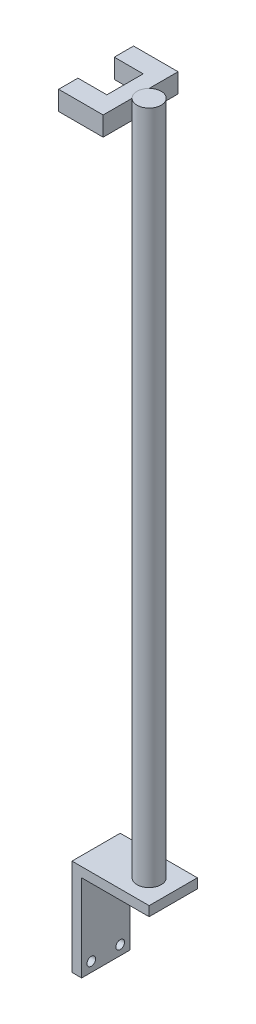
ISO-10303-21;
HEADER;
FILE_DESCRIPTION(('STEP AP214'),'2;1');
FILE_NAME('part.step','',(''),(''),'','','');
FILE_SCHEMA(('AUTOMOTIVE_DESIGN { 1 0 10303 214 1 1 1 1 }'));
ENDSEC;
DATA;
#1=APPLICATION_CONTEXT('core data for automotive mechanical design processes');
#2=APPLICATION_PROTOCOL_DEFINITION('international standard','automotive_design',2000,#1);
#3=PRODUCT_CONTEXT('',#1,'mechanical');
#4=PRODUCT('Part','Part','',(#3));
#5=PRODUCT_RELATED_PRODUCT_CATEGORY('part','',(#4));
#6=PRODUCT_DEFINITION_FORMATION('','',#4);
#7=PRODUCT_DEFINITION_CONTEXT('part definition',#1,'design');
#8=PRODUCT_DEFINITION('design','',#6,#7);
#9=PRODUCT_DEFINITION_SHAPE('','',#8);
#10=(LENGTH_UNIT() NAMED_UNIT(*) SI_UNIT(.MILLI.,.METRE.));
#11=(NAMED_UNIT(*) PLANE_ANGLE_UNIT() SI_UNIT($,.RADIAN.));
#12=(NAMED_UNIT(*) SI_UNIT($,.STERADIAN.) SOLID_ANGLE_UNIT());
#13=UNCERTAINTY_MEASURE_WITH_UNIT(LENGTH_MEASURE(1.E-05),#10,'distance_accuracy_value','');
#14=(GEOMETRIC_REPRESENTATION_CONTEXT(3) GLOBAL_UNCERTAINTY_ASSIGNED_CONTEXT((#13)) GLOBAL_UNIT_ASSIGNED_CONTEXT((#10,
#11,#12)) REPRESENTATION_CONTEXT('',''));
#15=CARTESIAN_POINT('',(0.,0.,0.));
#16=DIRECTION('',(0.,0.,1.));
#17=DIRECTION('',(1.,0.,0.));
#18=AXIS2_PLACEMENT_3D('',#15,#16,#17);
#19=CARTESIAN_POINT('',(46.1611652351682,780.,0.));
#20=DIRECTION('',(-1.,0.,0.));
#21=DIRECTION('',(0.,0.,1.));
#22=AXIS2_PLACEMENT_3D('',#19,#20,#21);
#23=PLANE('',#22);
#24=DIRECTION('',(0.,0.,1.));
#25=VECTOR('',#24,1.);
#26=CARTESIAN_POINT('',(46.1611652351682,800.,0.));
#27=LINE('',#26,#25);
#28=CARTESIAN_POINT('',(46.1611652351682,800.,-63.8388347648319));
#29=VERTEX_POINT('',#28);
#30=CARTESIAN_POINT('',(46.1611652351682,800.,-33.8388347648319));
#31=VERTEX_POINT('',#30);
#32=EDGE_CURVE('E156',#29,#31,#27,.T.);
#33=ORIENTED_EDGE('',*,*,#32,.T.);
#34=DIRECTION('',(0.,1.,0.));
#35=VECTOR('',#34,1.);
#36=CARTESIAN_POINT('',(46.1611652351682,780.,-33.8388347648319));
#37=LINE('',#36,#35);
#38=CARTESIAN_POINT('',(46.1611652351682,780.,-33.8388347648319));
#39=VERTEX_POINT('',#38);
#40=EDGE_CURVE('E12',#39,#31,#37,.T.);
#41=ORIENTED_EDGE('',*,*,#40,.F.);
#42=DIRECTION('',(0.,0.,1.));
#43=VECTOR('',#42,1.);
#44=CARTESIAN_POINT('',(46.1611652351682,780.,0.));
#45=LINE('',#44,#43);
#46=CARTESIAN_POINT('',(46.1611652351682,780.,-63.8388347648319));
#47=VERTEX_POINT('',#46);
#48=EDGE_CURVE('E174',#47,#39,#45,.T.);
#49=ORIENTED_EDGE('',*,*,#48,.F.);
#50=DIRECTION('',(0.,1.,0.));
#51=VECTOR('',#50,1.);
#52=CARTESIAN_POINT('',(46.1611652351682,780.,-63.8388347648319));
#53=LINE('',#52,#51);
#54=EDGE_CURVE('E52',#47,#29,#53,.T.);
#55=ORIENTED_EDGE('',*,*,#54,.T.);
#56=EDGE_LOOP('',(#33,#41,#49,#55));
#57=FACE_BOUND('',#56,.T.);
#58=ADVANCED_FACE('F49',(#57),#23,.F.);
#59=CARTESIAN_POINT('',(55.,780.,-25.));
#60=DIRECTION('',(0.,1.,0.));
#61=DIRECTION('',(0.,0.,1.));
#62=AXIS2_PLACEMENT_3D('',#59,#60,#61);
#63=CYLINDRICAL_SURFACE('',#62,12.5);
#64=CARTESIAN_POINT('',(55.,800.,-25.));
#65=DIRECTION('',(0.,1.,0.));
#66=DIRECTION('',(0.,0.,1.));
#67=AXIS2_PLACEMENT_3D('',#64,#65,#66);
#68=CIRCLE('',#67,12.5);
#69=CARTESIAN_POINT('',(46.1611652351682,800.,-16.1611652351681));
#70=VERTEX_POINT('',#69);
#71=EDGE_CURVE('E98',#31,#70,#68,.T.);
#72=ORIENTED_EDGE('',*,*,#71,.T.);
#73=DIRECTION('',(0.,1.,0.));
#74=VECTOR('',#73,1.);
#75=CARTESIAN_POINT('',(46.1611652351682,780.,-16.1611652351681));
#76=LINE('',#75,#74);
#77=CARTESIAN_POINT('',(46.1611652351682,780.,-16.1611652351681));
#78=VERTEX_POINT('',#77);
#79=EDGE_CURVE('E58',#78,#70,#76,.T.);
#80=ORIENTED_EDGE('',*,*,#79,.F.);
#81=CARTESIAN_POINT('',(55.,780.,-25.));
#82=DIRECTION('',(0.,1.,0.));
#83=DIRECTION('',(0.,0.,1.));
#84=AXIS2_PLACEMENT_3D('',#81,#82,#83);
#85=CIRCLE('',#84,12.5);
#86=EDGE_CURVE('E66',#39,#78,#85,.T.);
#87=ORIENTED_EDGE('',*,*,#86,.F.);
#88=ORIENTED_EDGE('',*,*,#40,.T.);
#89=EDGE_LOOP('',(#72,#80,#87,#88));
#90=FACE_BOUND('',#89,.T.);
#91=ADVANCED_FACE('F213',(#90),#63,.F.);
#92=CARTESIAN_POINT('',(46.1611652351682,780.,0.));
#93=DIRECTION('',(-1.,0.,0.));
#94=DIRECTION('',(0.,0.,1.));
#95=AXIS2_PLACEMENT_3D('',#92,#93,#94);
#96=PLANE('',#95);
#97=DIRECTION('',(0.,0.,1.));
#98=VECTOR('',#97,1.);
#99=CARTESIAN_POINT('',(46.1611652351682,800.,0.));
#100=LINE('',#99,#98);
#101=CARTESIAN_POINT('',(46.1611652351682,800.,13.8388347648318));
#102=VERTEX_POINT('',#101);
#103=EDGE_CURVE('E141',#70,#102,#100,.T.);
#104=ORIENTED_EDGE('',*,*,#103,.T.);
#105=DIRECTION('',(0.,1.,0.));
#106=VECTOR('',#105,1.);
#107=CARTESIAN_POINT('',(46.1611652351682,780.,13.8388347648318));
#108=LINE('',#107,#106);
#109=CARTESIAN_POINT('',(46.1611652351682,780.,13.8388347648318));
#110=VERTEX_POINT('',#109);
#111=EDGE_CURVE('E139',#110,#102,#108,.T.);
#112=ORIENTED_EDGE('',*,*,#111,.F.);
#113=DIRECTION('',(0.,0.,1.));
#114=VECTOR('',#113,1.);
#115=CARTESIAN_POINT('',(46.1611652351682,780.,0.));
#116=LINE('',#115,#114);
#117=EDGE_CURVE('E130',#78,#110,#116,.T.);
#118=ORIENTED_EDGE('',*,*,#117,.F.);
#119=ORIENTED_EDGE('',*,*,#79,.T.);
#120=EDGE_LOOP('',(#104,#112,#118,#119));
#121=FACE_BOUND('',#120,.T.);
#122=ADVANCED_FACE('F140',(#121),#96,.F.);
#123=CARTESIAN_POINT('',(0.,780.,13.8388347648318));
#124=DIRECTION('',(0.,0.,-1.));
#125=DIRECTION('',(-1.,0.,0.));
#126=AXIS2_PLACEMENT_3D('',#123,#124,#125);
#127=PLANE('',#126);
#128=DIRECTION('',(-1.,0.,0.));
#129=VECTOR('',#128,1.);
#130=CARTESIAN_POINT('',(0.,800.,13.8388347648318));
#131=LINE('',#130,#129);
#132=CARTESIAN_POINT('',(0.,800.,13.8388347648318));
#133=VERTEX_POINT('',#132);
#134=EDGE_CURVE('E171',#102,#133,#131,.T.);
#135=ORIENTED_EDGE('',*,*,#134,.T.);
#136=DIRECTION('',(0.,1.,0.));
#137=VECTOR('',#136,1.);
#138=CARTESIAN_POINT('',(0.,780.,13.8388347648318));
#139=LINE('',#138,#137);
#140=CARTESIAN_POINT('',(0.,780.,13.8388347648318));
#141=VERTEX_POINT('',#140);
#142=EDGE_CURVE('E144',#141,#133,#139,.T.);
#143=ORIENTED_EDGE('',*,*,#142,.F.);
#144=DIRECTION('',(-1.,0.,0.));
#145=VECTOR('',#144,1.);
#146=CARTESIAN_POINT('',(0.,780.,13.8388347648318));
#147=LINE('',#146,#145);
#148=EDGE_CURVE('E134',#110,#141,#147,.T.);
#149=ORIENTED_EDGE('',*,*,#148,.F.);
#150=ORIENTED_EDGE('',*,*,#111,.T.);
#151=EDGE_LOOP('',(#135,#143,#149,#150));
#152=FACE_BOUND('',#151,.T.);
#153=ADVANCED_FACE('F146',(#152),#127,.F.);
#154=CARTESIAN_POINT('',(0.,780.,0.));
#155=DIRECTION('',(1.,0.,0.));
#156=DIRECTION('',(0.,0.,-1.));
#157=AXIS2_PLACEMENT_3D('',#154,#155,#156);
#158=PLANE('',#157);
#159=DIRECTION('',(0.,0.,-1.));
#160=VECTOR('',#159,1.);
#161=CARTESIAN_POINT('',(0.,800.,0.));
#162=LINE('',#161,#160);
#163=CARTESIAN_POINT('',(0.,800.,-6.16116523516823));
#164=VERTEX_POINT('',#163);
#165=EDGE_CURVE('E169',#133,#164,#162,.T.);
#166=ORIENTED_EDGE('',*,*,#165,.T.);
#167=DIRECTION('',(0.,1.,0.));
#168=VECTOR('',#167,1.);
#169=CARTESIAN_POINT('',(0.,780.,-6.16116523516823));
#170=LINE('',#169,#168);
#171=CARTESIAN_POINT('',(0.,780.,-6.16116523516823));
#172=VERTEX_POINT('',#171);
#173=EDGE_CURVE('E178',#172,#164,#170,.T.);
#174=ORIENTED_EDGE('',*,*,#173,.F.);
#175=DIRECTION('',(0.,0.,-1.));
#176=VECTOR('',#175,1.);
#177=CARTESIAN_POINT('',(0.,780.,0.));
#178=LINE('',#177,#176);
#179=EDGE_CURVE('E149',#141,#172,#178,.T.);
#180=ORIENTED_EDGE('',*,*,#179,.F.);
#181=ORIENTED_EDGE('',*,*,#142,.T.);
#182=EDGE_LOOP('',(#166,#174,#180,#181));
#183=FACE_BOUND('',#182,.T.);
#184=ADVANCED_FACE('F226',(#183),#158,.F.);
#185=CARTESIAN_POINT('',(0.,780.,-6.16116523516823));
#186=DIRECTION('',(0.,0.,1.));
#187=DIRECTION('',(1.,0.,0.));
#188=AXIS2_PLACEMENT_3D('',#185,#186,#187);
#189=PLANE('',#188);
#190=DIRECTION('',(1.,0.,0.));
#191=VECTOR('',#190,1.);
#192=CARTESIAN_POINT('',(0.,800.,-6.16116523516823));
#193=LINE('',#192,#191);
#194=CARTESIAN_POINT('',(30.,800.,-6.16116523516823));
#195=VERTEX_POINT('',#194);
#196=EDGE_CURVE('E167',#164,#195,#193,.T.);
#197=ORIENTED_EDGE('',*,*,#196,.T.);
#198=DIRECTION('',(0.,1.,0.));
#199=VECTOR('',#198,1.);
#200=CARTESIAN_POINT('',(30.,780.,-6.16116523516823));
#201=LINE('',#200,#199);
#202=CARTESIAN_POINT('',(30.,780.,-6.16116523516823));
#203=VERTEX_POINT('',#202);
#204=EDGE_CURVE('E181',#203,#195,#201,.T.);
#205=ORIENTED_EDGE('',*,*,#204,.F.);
#206=DIRECTION('',(1.,0.,0.));
#207=VECTOR('',#206,1.);
#208=CARTESIAN_POINT('',(0.,780.,-6.16116523516823));
#209=LINE('',#208,#207);
#210=EDGE_CURVE('E151',#172,#203,#209,.T.);
#211=ORIENTED_EDGE('',*,*,#210,.F.);
#212=ORIENTED_EDGE('',*,*,#173,.T.);
#213=EDGE_LOOP('',(#197,#205,#211,#212));
#214=FACE_BOUND('',#213,.T.);
#215=ADVANCED_FACE('F229',(#214),#189,.F.);
#216=CARTESIAN_POINT('',(30.,780.,0.));
#217=DIRECTION('',(1.,0.,0.));
#218=DIRECTION('',(0.,0.,-1.));
#219=AXIS2_PLACEMENT_3D('',#216,#217,#218);
#220=PLANE('',#219);
#221=DIRECTION('',(0.,0.,-1.));
#222=VECTOR('',#221,1.);
#223=CARTESIAN_POINT('',(30.,800.,0.));
#224=LINE('',#223,#222);
#225=CARTESIAN_POINT('',(30.,800.,-43.8388347648319));
#226=VERTEX_POINT('',#225);
#227=EDGE_CURVE('E165',#195,#226,#224,.T.);
#228=ORIENTED_EDGE('',*,*,#227,.T.);
#229=DIRECTION('',(0.,1.,0.));
#230=VECTOR('',#229,1.);
#231=CARTESIAN_POINT('',(30.,780.,-43.8388347648319));
#232=LINE('',#231,#230);
#233=CARTESIAN_POINT('',(30.,780.,-43.8388347648319));
#234=VERTEX_POINT('',#233);
#235=EDGE_CURVE('E184',#234,#226,#232,.T.);
#236=ORIENTED_EDGE('',*,*,#235,.F.);
#237=DIRECTION('',(0.,0.,-1.));
#238=VECTOR('',#237,1.);
#239=CARTESIAN_POINT('',(30.,780.,0.));
#240=LINE('',#239,#238);
#241=EDGE_CURVE('E250',#203,#234,#240,.T.);
#242=ORIENTED_EDGE('',*,*,#241,.F.);
#243=ORIENTED_EDGE('',*,*,#204,.T.);
#244=EDGE_LOOP('',(#228,#236,#242,#243));
#245=FACE_BOUND('',#244,.T.);
#246=ADVANCED_FACE('F233',(#245),#220,.F.);
#247=CARTESIAN_POINT('',(0.,780.,-43.8388347648319));
#248=DIRECTION('',(0.,0.,-1.));
#249=DIRECTION('',(-1.,0.,0.));
#250=AXIS2_PLACEMENT_3D('',#247,#248,#249);
#251=PLANE('',#250);
#252=DIRECTION('',(-1.,0.,0.));
#253=VECTOR('',#252,1.);
#254=CARTESIAN_POINT('',(0.,800.,-43.8388347648319));
#255=LINE('',#254,#253);
#256=CARTESIAN_POINT('',(0.,800.,-43.8388347648319));
#257=VERTEX_POINT('',#256);
#258=EDGE_CURVE('E163',#226,#257,#255,.T.);
#259=ORIENTED_EDGE('',*,*,#258,.T.);
#260=DIRECTION('',(0.,1.,0.));
#261=VECTOR('',#260,1.);
#262=CARTESIAN_POINT('',(0.,780.,-43.8388347648319));
#263=LINE('',#262,#261);
#264=CARTESIAN_POINT('',(0.,780.,-43.8388347648319));
#265=VERTEX_POINT('',#264);
#266=EDGE_CURVE('E187',#265,#257,#263,.T.);
#267=ORIENTED_EDGE('',*,*,#266,.F.);
#268=DIRECTION('',(-1.,0.,0.));
#269=VECTOR('',#268,1.);
#270=CARTESIAN_POINT('',(0.,780.,-43.8388347648319));
#271=LINE('',#270,#269);
#272=EDGE_CURVE('E248',#234,#265,#271,.T.);
#273=ORIENTED_EDGE('',*,*,#272,.F.);
#274=ORIENTED_EDGE('',*,*,#235,.T.);
#275=EDGE_LOOP('',(#259,#267,#273,#274));
#276=FACE_BOUND('',#275,.T.);
#277=ADVANCED_FACE('F209',(#276),#251,.F.);
#278=CARTESIAN_POINT('',(0.,780.,0.));
#279=DIRECTION('',(1.,0.,0.));
#280=DIRECTION('',(0.,0.,-1.));
#281=AXIS2_PLACEMENT_3D('',#278,#279,#280);
#282=PLANE('',#281);
#283=DIRECTION('',(0.,0.,-1.));
#284=VECTOR('',#283,1.);
#285=CARTESIAN_POINT('',(0.,800.,0.));
#286=LINE('',#285,#284);
#287=CARTESIAN_POINT('',(0.,800.,-63.8388347648319));
#288=VERTEX_POINT('',#287);
#289=EDGE_CURVE('E161',#257,#288,#286,.T.);
#290=ORIENTED_EDGE('',*,*,#289,.T.);
#291=DIRECTION('',(0.,1.,0.));
#292=VECTOR('',#291,1.);
#293=CARTESIAN_POINT('',(0.,780.,-63.8388347648319));
#294=LINE('',#293,#292);
#295=CARTESIAN_POINT('',(0.,780.,-63.8388347648319));
#296=VERTEX_POINT('',#295);
#297=EDGE_CURVE('E189',#296,#288,#294,.T.);
#298=ORIENTED_EDGE('',*,*,#297,.F.);
#299=DIRECTION('',(0.,0.,-1.));
#300=VECTOR('',#299,1.);
#301=CARTESIAN_POINT('',(0.,780.,0.));
#302=LINE('',#301,#300);
#303=EDGE_CURVE('E247',#265,#296,#302,.T.);
#304=ORIENTED_EDGE('',*,*,#303,.F.);
#305=ORIENTED_EDGE('',*,*,#266,.T.);
#306=EDGE_LOOP('',(#290,#298,#304,#305));
#307=FACE_BOUND('',#306,.T.);
#308=ADVANCED_FACE('F203',(#307),#282,.F.);
#309=CARTESIAN_POINT('',(0.,780.,-63.8388347648319));
#310=DIRECTION('',(0.,0.,1.));
#311=DIRECTION('',(1.,0.,0.));
#312=AXIS2_PLACEMENT_3D('',#309,#310,#311);
#313=PLANE('',#312);
#314=DIRECTION('',(1.,0.,0.));
#315=VECTOR('',#314,1.);
#316=CARTESIAN_POINT('',(0.,800.,-63.8388347648319));
#317=LINE('',#316,#315);
#318=EDGE_CURVE('E159',#288,#29,#317,.T.);
#319=ORIENTED_EDGE('',*,*,#318,.T.);
#320=ORIENTED_EDGE('',*,*,#54,.F.);
#321=DIRECTION('',(1.,0.,0.));
#322=VECTOR('',#321,1.);
#323=CARTESIAN_POINT('',(0.,780.,-63.8388347648319));
#324=LINE('',#323,#322);
#325=EDGE_CURVE('E110',#296,#47,#324,.T.);
#326=ORIENTED_EDGE('',*,*,#325,.F.);
#327=ORIENTED_EDGE('',*,*,#297,.T.);
#328=EDGE_LOOP('',(#319,#320,#326,#327));
#329=FACE_BOUND('',#328,.T.);
#330=ADVANCED_FACE('F201',(#329),#313,.F.);
#331=CARTESIAN_POINT('',(0.,780.,0.));
#332=DIRECTION('',(0.,1.,0.));
#333=DIRECTION('',(0.,0.,1.));
#334=AXIS2_PLACEMENT_3D('',#331,#332,#333);
#335=PLANE('',#334);
#336=ORIENTED_EDGE('',*,*,#48,.T.);
#337=ORIENTED_EDGE('',*,*,#86,.T.);
#338=ORIENTED_EDGE('',*,*,#117,.T.);
#339=ORIENTED_EDGE('',*,*,#148,.T.);
#340=ORIENTED_EDGE('',*,*,#179,.T.);
#341=ORIENTED_EDGE('',*,*,#210,.T.);
#342=ORIENTED_EDGE('',*,*,#241,.T.);
#343=ORIENTED_EDGE('',*,*,#272,.T.);
#344=ORIENTED_EDGE('',*,*,#303,.T.);
#345=ORIENTED_EDGE('',*,*,#325,.T.);
#346=EDGE_LOOP('',(#336,#337,#338,#339,#340,#341,#342,#343,#344,#345));
#347=FACE_BOUND('',#346,.T.);
#348=ADVANCED_FACE('F132',(#347),#335,.F.);
#349=CARTESIAN_POINT('',(0.,800.,0.));
#350=DIRECTION('',(0.,1.,0.));
#351=DIRECTION('',(0.,0.,1.));
#352=AXIS2_PLACEMENT_3D('',#349,#350,#351);
#353=PLANE('',#352);
#354=ORIENTED_EDGE('',*,*,#32,.F.);
#355=ORIENTED_EDGE('',*,*,#318,.F.);
#356=ORIENTED_EDGE('',*,*,#289,.F.);
#357=ORIENTED_EDGE('',*,*,#258,.F.);
#358=ORIENTED_EDGE('',*,*,#227,.F.);
#359=ORIENTED_EDGE('',*,*,#196,.F.);
#360=ORIENTED_EDGE('',*,*,#165,.F.);
#361=ORIENTED_EDGE('',*,*,#134,.F.);
#362=ORIENTED_EDGE('',*,*,#103,.F.);
#363=ORIENTED_EDGE('',*,*,#71,.F.);
#364=EDGE_LOOP('',(#354,#355,#356,#357,#358,#359,#360,#361,#362,#363));
#365=FACE_BOUND('',#364,.T.);
#366=ADVANCED_FACE('F198',(#365),#353,.T.);
#367=CLOSED_SHELL('',(#58,#91,#122,#153,#184,#215,#246,#277,#308,#330,#348,#366));
#368=MANIFOLD_SOLID_BREP('B2',#367);
#369=CARTESIAN_POINT('',(10.,0.,0.));
#370=DIRECTION('',(-1.,0.,0.));
#371=DIRECTION('',(0.,0.,1.));
#372=AXIS2_PLACEMENT_3D('',#369,#370,#371);
#373=PLANE('',#372);
#374=DIRECTION('',(0.,1.,0.));
#375=VECTOR('',#374,1.);
#376=CARTESIAN_POINT('',(10.,0.,-50.));
#377=LINE('',#376,#375);
#378=CARTESIAN_POINT('',(10.,0.,-50.));
#379=VERTEX_POINT('',#378);
#380=CARTESIAN_POINT('',(10.,90.,-50.));
#381=VERTEX_POINT('',#380);
#382=EDGE_CURVE('E374',#379,#381,#377,.T.);
#383=ORIENTED_EDGE('',*,*,#382,.T.);
#384=DIRECTION('',(0.,0.,1.));
#385=VECTOR('',#384,1.);
#386=CARTESIAN_POINT('',(10.,90.,0.));
#387=LINE('',#386,#385);
#388=CARTESIAN_POINT('',(10.,90.,0.));
#389=VERTEX_POINT('',#388);
#390=EDGE_CURVE('E369',#381,#389,#387,.T.);
#391=ORIENTED_EDGE('',*,*,#390,.T.);
#392=DIRECTION('',(0.,-1.,0.));
#393=VECTOR('',#392,1.);
#394=CARTESIAN_POINT('',(10.,0.,0.));
#395=LINE('',#394,#393);
#396=CARTESIAN_POINT('',(10.,0.,0.));
#397=VERTEX_POINT('',#396);
#398=EDGE_CURVE('E453',#389,#397,#395,.T.);
#399=ORIENTED_EDGE('',*,*,#398,.T.);
#400=DIRECTION('',(0.,0.,-1.));
#401=VECTOR('',#400,1.);
#402=CARTESIAN_POINT('',(10.,0.,0.));
#403=LINE('',#402,#401);
#404=EDGE_CURVE('E455',#397,#379,#403,.T.);
#405=ORIENTED_EDGE('',*,*,#404,.T.);
#406=EDGE_LOOP('',(#383,#391,#399,#405));
#407=FACE_BOUND('',#406,.T.);
#408=CARTESIAN_POINT('',(10.,10.,-10.));
#409=DIRECTION('',(1.,0.,0.));
#410=DIRECTION('',(0.,0.,-1.));
#411=AXIS2_PLACEMENT_3D('',#408,#409,#410);
#412=CIRCLE('',#411,4.5);
#413=CARTESIAN_POINT('',(10.,10.,-14.5));
#414=VERTEX_POINT('',#413);
#415=EDGE_CURVE('E447',#414,#414,#412,.T.);
#416=ORIENTED_EDGE('',*,*,#415,.F.);
#417=EDGE_LOOP('',(#416));
#418=FACE_BOUND('',#417,.T.);
#419=CARTESIAN_POINT('',(10.,10.,-40.));
#420=DIRECTION('',(1.,0.,0.));
#421=DIRECTION('',(0.,0.,-1.));
#422=AXIS2_PLACEMENT_3D('',#419,#420,#421);
#423=CIRCLE('',#422,4.5);
#424=CARTESIAN_POINT('',(10.,10.,-44.5));
#425=VERTEX_POINT('',#424);
#426=EDGE_CURVE('E441',#425,#425,#423,.T.);
#427=ORIENTED_EDGE('',*,*,#426,.F.);
#428=EDGE_LOOP('',(#427));
#429=FACE_BOUND('',#428,.T.);
#430=ADVANCED_FACE('F353',(#407,#418,#429),#373,.F.);
#431=CARTESIAN_POINT('',(0.,0.,0.));
#432=DIRECTION('',(-1.,0.,0.));
#433=DIRECTION('',(0.,0.,1.));
#434=AXIS2_PLACEMENT_3D('',#431,#432,#433);
#435=PLANE('',#434);
#436=DIRECTION('',(0.,0.,-1.));
#437=VECTOR('',#436,1.);
#438=CARTESIAN_POINT('',(0.,0.,0.));
#439=LINE('',#438,#437);
#440=CARTESIAN_POINT('',(0.,0.,0.));
#441=VERTEX_POINT('',#440);
#442=CARTESIAN_POINT('',(0.,0.,-50.));
#443=VERTEX_POINT('',#442);
#444=EDGE_CURVE('E459',#441,#443,#439,.T.);
#445=ORIENTED_EDGE('',*,*,#444,.F.);
#446=DIRECTION('',(0.,-1.,0.));
#447=VECTOR('',#446,1.);
#448=CARTESIAN_POINT('',(0.,0.,0.));
#449=LINE('',#448,#447);
#450=CARTESIAN_POINT('',(0.,100.,0.));
#451=VERTEX_POINT('',#450);
#452=EDGE_CURVE('E450',#451,#441,#449,.T.);
#453=ORIENTED_EDGE('',*,*,#452,.F.);
#454=DIRECTION('',(0.,0.,1.));
#455=VECTOR('',#454,1.);
#456=CARTESIAN_POINT('',(0.,100.,0.));
#457=LINE('',#456,#455);
#458=CARTESIAN_POINT('',(0.,100.,-50.));
#459=VERTEX_POINT('',#458);
#460=EDGE_CURVE('E412',#459,#451,#457,.T.);
#461=ORIENTED_EDGE('',*,*,#460,.F.);
#462=DIRECTION('',(0.,1.,0.));
#463=VECTOR('',#462,1.);
#464=CARTESIAN_POINT('',(0.,0.,-50.));
#465=LINE('',#464,#463);
#466=EDGE_CURVE('E461',#443,#459,#465,.T.);
#467=ORIENTED_EDGE('',*,*,#466,.F.);
#468=EDGE_LOOP('',(#445,#453,#461,#467));
#469=FACE_BOUND('',#468,.T.);
#470=CARTESIAN_POINT('',(0.,10.,-10.));
#471=DIRECTION('',(1.,0.,0.));
#472=DIRECTION('',(0.,0.,-1.));
#473=AXIS2_PLACEMENT_3D('',#470,#471,#472);
#474=CIRCLE('',#473,4.5);
#475=CARTESIAN_POINT('',(0.,10.,-14.5));
#476=VERTEX_POINT('',#475);
#477=EDGE_CURVE('E444',#476,#476,#474,.T.);
#478=ORIENTED_EDGE('',*,*,#477,.T.);
#479=EDGE_LOOP('',(#478));
#480=FACE_BOUND('',#479,.T.);
#481=CARTESIAN_POINT('',(0.,10.,-40.));
#482=DIRECTION('',(1.,0.,0.));
#483=DIRECTION('',(0.,0.,-1.));
#484=AXIS2_PLACEMENT_3D('',#481,#482,#483);
#485=CIRCLE('',#484,4.5);
#486=CARTESIAN_POINT('',(0.,10.,-44.5));
#487=VERTEX_POINT('',#486);
#488=EDGE_CURVE('E440',#487,#487,#485,.T.);
#489=ORIENTED_EDGE('',*,*,#488,.T.);
#490=EDGE_LOOP('',(#489));
#491=FACE_BOUND('',#490,.T.);
#492=ADVANCED_FACE('F476',(#469,#480,#491),#435,.T.);
#493=CARTESIAN_POINT('',(10.,0.,0.));
#494=DIRECTION('',(0.,0.,-1.));
#495=DIRECTION('',(-1.,0.,0.));
#496=AXIS2_PLACEMENT_3D('',#493,#494,#495);
#497=PLANE('',#496);
#498=ORIENTED_EDGE('',*,*,#398,.F.);
#499=DIRECTION('',(-1.,0.,0.));
#500=VECTOR('',#499,1.);
#501=CARTESIAN_POINT('',(0.,90.,0.));
#502=LINE('',#501,#500);
#503=CARTESIAN_POINT('',(80.,90.,0.));
#504=VERTEX_POINT('',#503);
#505=EDGE_CURVE('E426',#504,#389,#502,.T.);
#506=ORIENTED_EDGE('',*,*,#505,.F.);
#507=DIRECTION('',(0.,-1.,0.));
#508=VECTOR('',#507,1.);
#509=CARTESIAN_POINT('',(80.,100.,0.));
#510=LINE('',#509,#508);
#511=CARTESIAN_POINT('',(80.,100.,0.));
#512=VERTEX_POINT('',#511);
#513=EDGE_CURVE('E421',#512,#504,#510,.T.);
#514=ORIENTED_EDGE('',*,*,#513,.F.);
#515=DIRECTION('',(-1.,0.,0.));
#516=VECTOR('',#515,1.);
#517=CARTESIAN_POINT('',(10.,100.,0.));
#518=LINE('',#517,#516);
#519=EDGE_CURVE('E405',#512,#451,#518,.T.);
#520=ORIENTED_EDGE('',*,*,#519,.T.);
#521=ORIENTED_EDGE('',*,*,#452,.T.);
#522=DIRECTION('',(-1.,0.,0.));
#523=VECTOR('',#522,1.);
#524=CARTESIAN_POINT('',(10.,0.,0.));
#525=LINE('',#524,#523);
#526=EDGE_CURVE('E357',#397,#441,#525,.T.);
#527=ORIENTED_EDGE('',*,*,#526,.F.);
#528=EDGE_LOOP('',(#498,#506,#514,#520,#521,#527));
#529=FACE_BOUND('',#528,.T.);
#530=ADVANCED_FACE('F355',(#529),#497,.F.);
#531=CARTESIAN_POINT('',(10.,0.,0.));
#532=DIRECTION('',(0.,1.,0.));
#533=DIRECTION('',(0.,0.,1.));
#534=AXIS2_PLACEMENT_3D('',#531,#532,#533);
#535=PLANE('',#534);
#536=ORIENTED_EDGE('',*,*,#444,.T.);
#537=DIRECTION('',(-1.,0.,0.));
#538=VECTOR('',#537,1.);
#539=CARTESIAN_POINT('',(10.,0.,-50.));
#540=LINE('',#539,#538);
#541=EDGE_CURVE('E464',#379,#443,#540,.T.);
#542=ORIENTED_EDGE('',*,*,#541,.F.);
#543=ORIENTED_EDGE('',*,*,#404,.F.);
#544=ORIENTED_EDGE('',*,*,#526,.T.);
#545=EDGE_LOOP('',(#536,#542,#543,#544));
#546=FACE_BOUND('',#545,.T.);
#547=ADVANCED_FACE('F473',(#546),#535,.F.);
#548=CARTESIAN_POINT('',(10.,0.,-50.));
#549=DIRECTION('',(0.,0.,1.));
#550=DIRECTION('',(1.,0.,0.));
#551=AXIS2_PLACEMENT_3D('',#548,#549,#550);
#552=PLANE('',#551);
#553=ORIENTED_EDGE('',*,*,#466,.T.);
#554=DIRECTION('',(-1.,0.,0.));
#555=VECTOR('',#554,1.);
#556=CARTESIAN_POINT('',(10.,100.,-50.));
#557=LINE('',#556,#555);
#558=CARTESIAN_POINT('',(80.,100.,-50.));
#559=VERTEX_POINT('',#558);
#560=EDGE_CURVE('E416',#559,#459,#557,.T.);
#561=ORIENTED_EDGE('',*,*,#560,.F.);
#562=DIRECTION('',(0.,-1.,0.));
#563=VECTOR('',#562,1.);
#564=CARTESIAN_POINT('',(80.,100.,-50.));
#565=LINE('',#564,#563);
#566=CARTESIAN_POINT('',(80.,90.,-50.));
#567=VERTEX_POINT('',#566);
#568=EDGE_CURVE('E424',#559,#567,#565,.T.);
#569=ORIENTED_EDGE('',*,*,#568,.T.);
#570=DIRECTION('',(-1.,0.,0.));
#571=VECTOR('',#570,1.);
#572=CARTESIAN_POINT('',(0.,90.,-50.));
#573=LINE('',#572,#571);
#574=EDGE_CURVE('E429',#567,#381,#573,.T.);
#575=ORIENTED_EDGE('',*,*,#574,.T.);
#576=ORIENTED_EDGE('',*,*,#382,.F.);
#577=ORIENTED_EDGE('',*,*,#541,.T.);
#578=EDGE_LOOP('',(#553,#561,#569,#575,#576,#577));
#579=FACE_BOUND('',#578,.T.);
#580=ADVANCED_FACE('F478',(#579),#552,.F.);
#581=CARTESIAN_POINT('',(10.,100.,0.));
#582=DIRECTION('',(0.,-1.,0.));
#583=DIRECTION('',(0.,0.,-1.));
#584=AXIS2_PLACEMENT_3D('',#581,#582,#583);
#585=PLANE('',#584);
#586=CARTESIAN_POINT('',(55.,100.,-25.));
#587=DIRECTION('',(0.,1.,0.));
#588=DIRECTION('',(0.,0.,1.));
#589=AXIS2_PLACEMENT_3D('',#586,#587,#588);
#590=CIRCLE('',#589,12.5);
#591=CARTESIAN_POINT('',(55.,100.,-12.5));
#592=VERTEX_POINT('',#591);
#593=EDGE_CURVE('E47',#592,#592,#590,.T.);
#594=ORIENTED_EDGE('',*,*,#593,.F.);
#595=EDGE_LOOP('',(#594));
#596=FACE_BOUND('',#595,.T.);
#597=ORIENTED_EDGE('',*,*,#460,.T.);
#598=ORIENTED_EDGE('',*,*,#519,.F.);
#599=DIRECTION('',(0.,0.,-1.));
#600=VECTOR('',#599,1.);
#601=CARTESIAN_POINT('',(80.,100.,0.));
#602=LINE('',#601,#600);
#603=EDGE_CURVE('E409',#512,#559,#602,.T.);
#604=ORIENTED_EDGE('',*,*,#603,.T.);
#605=ORIENTED_EDGE('',*,*,#560,.T.);
#606=EDGE_LOOP('',(#597,#598,#604,#605));
#607=FACE_BOUND('',#606,.T.);
#608=ADVANCED_FACE('F407',(#596,#607),#585,.F.);
#609=CARTESIAN_POINT('',(10.,10.,-10.));
#610=DIRECTION('',(-1.,0.,0.));
#611=DIRECTION('',(0.,0.,1.));
#612=AXIS2_PLACEMENT_3D('',#609,#610,#611);
#613=CYLINDRICAL_SURFACE('',#612,4.5);
#614=ORIENTED_EDGE('',*,*,#415,.T.);
#615=EDGE_LOOP('',(#614));
#616=FACE_BOUND('',#615,.T.);
#617=ORIENTED_EDGE('',*,*,#477,.F.);
#618=EDGE_LOOP('',(#617));
#619=FACE_BOUND('',#618,.T.);
#620=ADVANCED_FACE('F491',(#616,#619),#613,.F.);
#621=CARTESIAN_POINT('',(10.,10.,-40.));
#622=DIRECTION('',(-1.,0.,0.));
#623=DIRECTION('',(0.,0.,1.));
#624=AXIS2_PLACEMENT_3D('',#621,#622,#623);
#625=CYLINDRICAL_SURFACE('',#624,4.5);
#626=ORIENTED_EDGE('',*,*,#426,.T.);
#627=EDGE_LOOP('',(#626));
#628=FACE_BOUND('',#627,.T.);
#629=ORIENTED_EDGE('',*,*,#488,.F.);
#630=EDGE_LOOP('',(#629));
#631=FACE_BOUND('',#630,.T.);
#632=ADVANCED_FACE('F483',(#628,#631),#625,.F.);
#633=CARTESIAN_POINT('',(0.,90.,0.));
#634=DIRECTION('',(0.,-1.,0.));
#635=DIRECTION('',(1.,0.,0.));
#636=AXIS2_PLACEMENT_3D('',#633,#634,#635);
#637=PLANE('',#636);
#638=ORIENTED_EDGE('',*,*,#390,.F.);
#639=ORIENTED_EDGE('',*,*,#574,.F.);
#640=DIRECTION('',(0.,0.,-1.));
#641=VECTOR('',#640,1.);
#642=CARTESIAN_POINT('',(80.,90.,0.));
#643=LINE('',#642,#641);
#644=EDGE_CURVE('E425',#504,#567,#643,.T.);
#645=ORIENTED_EDGE('',*,*,#644,.F.);
#646=ORIENTED_EDGE('',*,*,#505,.T.);
#647=EDGE_LOOP('',(#638,#639,#645,#646));
#648=FACE_BOUND('',#647,.T.);
#649=ADVANCED_FACE('F481',(#648),#637,.T.);
#650=CARTESIAN_POINT('',(80.,100.,0.));
#651=DIRECTION('',(1.,0.,0.));
#652=DIRECTION('',(0.,0.,-1.));
#653=AXIS2_PLACEMENT_3D('',#650,#651,#652);
#654=PLANE('',#653);
#655=ORIENTED_EDGE('',*,*,#568,.F.);
#656=ORIENTED_EDGE('',*,*,#603,.F.);
#657=ORIENTED_EDGE('',*,*,#513,.T.);
#658=ORIENTED_EDGE('',*,*,#644,.T.);
#659=EDGE_LOOP('',(#655,#656,#657,#658));
#660=FACE_BOUND('',#659,.T.);
#661=ADVANCED_FACE('F420',(#660),#654,.T.);
#662=CARTESIAN_POINT('',(55.,800.,-25.));
#663=DIRECTION('',(0.,-1.,0.));
#664=DIRECTION('',(0.,0.,-1.));
#665=AXIS2_PLACEMENT_3D('',#662,#663,#664);
#666=CYLINDRICAL_SURFACE('',#665,12.5);
#667=CARTESIAN_POINT('',(55.,800.,-25.));
#668=DIRECTION('',(0.,1.,0.));
#669=DIRECTION('',(0.,0.,1.));
#670=AXIS2_PLACEMENT_3D('',#667,#668,#669);
#671=CIRCLE('',#670,12.5);
#672=CARTESIAN_POINT('',(55.,800.,-12.5));
#673=VERTEX_POINT('',#672);
#674=EDGE_CURVE('E436',#673,#673,#671,.T.);
#675=ORIENTED_EDGE('',*,*,#674,.F.);
#676=EDGE_LOOP('',(#675));
#677=FACE_BOUND('',#676,.T.);
#678=ORIENTED_EDGE('',*,*,#593,.T.);
#679=EDGE_LOOP('',(#678));
#680=FACE_BOUND('',#679,.T.);
#681=ADVANCED_FACE('F489',(#677,#680),#666,.T.);
#682=CARTESIAN_POINT('',(55.,800.,-25.));
#683=DIRECTION('',(0.,1.,0.));
#684=DIRECTION('',(0.,0.,1.));
#685=AXIS2_PLACEMENT_3D('',#682,#683,#684);
#686=PLANE('',#685);
#687=ORIENTED_EDGE('',*,*,#674,.T.);
#688=EDGE_LOOP('',(#687));
#689=FACE_BOUND('',#688,.T.);
#690=ADVANCED_FACE('F593',(#689),#686,.T.);
#691=CLOSED_SHELL('',(#430,#492,#530,#547,#580,#608,#620,#632,#649,#661,#681,#690));
#692=MANIFOLD_SOLID_BREP('B6',#691);
#693=ADVANCED_BREP_SHAPE_REPRESENTATION('',(#18,#368,#692),#14);
#694=SHAPE_DEFINITION_REPRESENTATION(#9,#693);
ENDSEC;
END-ISO-10303-21;
